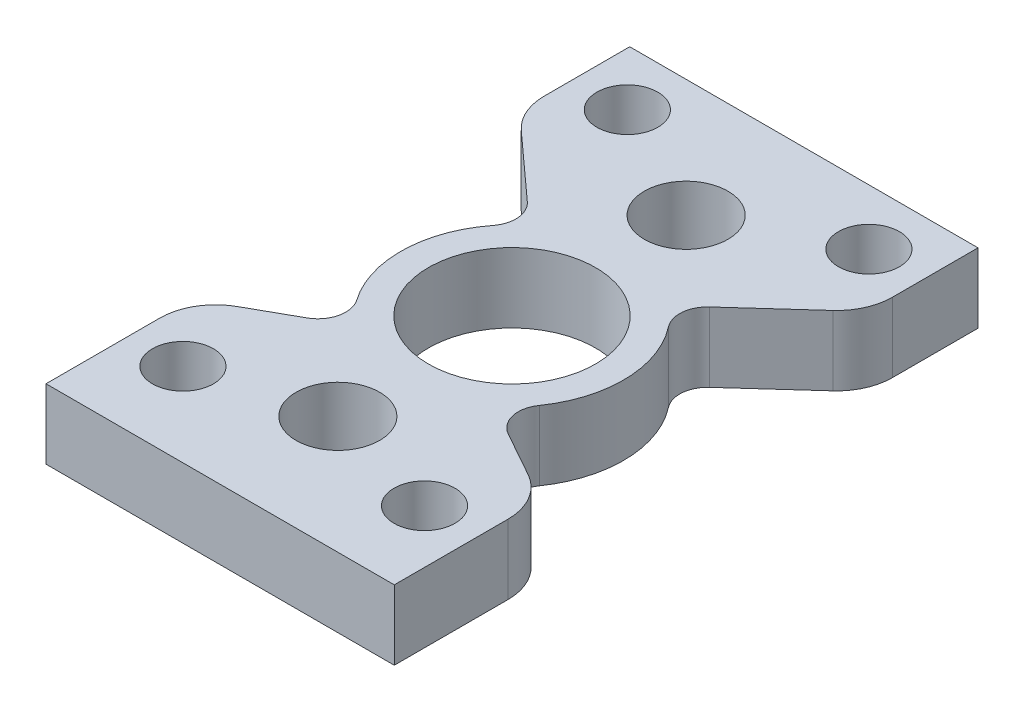
ISO-10303-21;
HEADER;
FILE_DESCRIPTION(('STEP AP214'),'2;1');
FILE_NAME('part.step','',(''),(''),'','','');
FILE_SCHEMA(('AUTOMOTIVE_DESIGN { 1 0 10303 214 1 1 1 1 }'));
ENDSEC;
DATA;
#1=APPLICATION_CONTEXT('core data for automotive mechanical design processes');
#2=APPLICATION_PROTOCOL_DEFINITION('international standard','automotive_design',2000,#1);
#3=PRODUCT_CONTEXT('',#1,'mechanical');
#4=PRODUCT('Part','Part','',(#3));
#5=PRODUCT_RELATED_PRODUCT_CATEGORY('part','',(#4));
#6=PRODUCT_DEFINITION_FORMATION('','',#4);
#7=PRODUCT_DEFINITION_CONTEXT('part definition',#1,'design');
#8=PRODUCT_DEFINITION('design','',#6,#7);
#9=PRODUCT_DEFINITION_SHAPE('','',#8);
#10=(LENGTH_UNIT() NAMED_UNIT(*) SI_UNIT(.MILLI.,.METRE.));
#11=(NAMED_UNIT(*) PLANE_ANGLE_UNIT() SI_UNIT($,.RADIAN.));
#12=(NAMED_UNIT(*) SI_UNIT($,.STERADIAN.) SOLID_ANGLE_UNIT());
#13=UNCERTAINTY_MEASURE_WITH_UNIT(LENGTH_MEASURE(1.E-05),#10,'distance_accuracy_value','');
#14=(GEOMETRIC_REPRESENTATION_CONTEXT(3) GLOBAL_UNCERTAINTY_ASSIGNED_CONTEXT((#13)) GLOBAL_UNIT_ASSIGNED_CONTEXT((#10,
#11,#12)) REPRESENTATION_CONTEXT('',''));
#15=CARTESIAN_POINT('',(0.,0.,0.));
#16=DIRECTION('',(0.,0.,1.));
#17=DIRECTION('',(1.,0.,0.));
#18=AXIS2_PLACEMENT_3D('',#15,#16,#17);
#19=CARTESIAN_POINT('',(-10.795,6.35,-18.8135112898051));
#20=DIRECTION('',(0.,-1.,0.));
#21=DIRECTION('',(0.,0.,-1.));
#22=AXIS2_PLACEMENT_3D('',#19,#20,#21);
#23=PLANE('',#22);
#24=CARTESIAN_POINT('',(3.49148133884313E-12,6.35,-15.8750000000001));
#25=DIRECTION('',(0.,1.,0.));
#26=DIRECTION('',(0.,0.,1.));
#27=AXIS2_PLACEMENT_3D('',#24,#25,#26);
#28=CIRCLE('',#27,3.81);
#29=CARTESIAN_POINT('',(3.49148133884313E-12,6.35,-12.0650000000001));
#30=VERTEX_POINT('',#29);
#31=EDGE_CURVE('E408',#30,#30,#28,.T.);
#32=ORIENTED_EDGE('',*,*,#31,.F.);
#33=EDGE_LOOP('',(#32));
#34=FACE_BOUND('',#33,.T.);
#35=CARTESIAN_POINT('',(-11.0109,6.35,-21.5265));
#36=DIRECTION('',(0.,1.,0.));
#37=DIRECTION('',(0.,0.,-1.));
#38=AXIS2_PLACEMENT_3D('',#35,#36,#37);
#39=CIRCLE('',#38,2.77876000000001);
#40=CARTESIAN_POINT('',(-11.0109,6.35,-24.30526));
#41=VERTEX_POINT('',#40);
#42=EDGE_CURVE('E420',#41,#41,#39,.T.);
#43=ORIENTED_EDGE('',*,*,#42,.F.);
#44=EDGE_LOOP('',(#43));
#45=FACE_BOUND('',#44,.T.);
#46=CARTESIAN_POINT('',(11.0109,6.35,18.9865));
#47=DIRECTION('',(0.,1.,0.));
#48=DIRECTION('',(0.,0.,1.));
#49=AXIS2_PLACEMENT_3D('',#46,#47,#48);
#50=CIRCLE('',#49,2.77876);
#51=CARTESIAN_POINT('',(11.0109,6.35,21.76526));
#52=VERTEX_POINT('',#51);
#53=EDGE_CURVE('E432',#52,#52,#50,.T.);
#54=ORIENTED_EDGE('',*,*,#53,.F.);
#55=EDGE_LOOP('',(#54));
#56=FACE_BOUND('',#55,.T.);
#57=DIRECTION('',(0.,0.,-1.));
#58=VECTOR('',#57,1.);
#59=CARTESIAN_POINT('',(15.875,6.35,-18.8135112898051));
#60=LINE('',#59,#58);
#61=CARTESIAN_POINT('',(15.875,6.35,-18.8135112898051));
#62=VERTEX_POINT('',#61);
#63=CARTESIAN_POINT('',(15.875,6.35,-26.6065));
#64=VERTEX_POINT('',#63);
#65=EDGE_CURVE('E241',#62,#64,#60,.T.);
#66=ORIENTED_EDGE('',*,*,#65,.T.);
#67=DIRECTION('',(-1.,0.,0.));
#68=VECTOR('',#67,1.);
#69=CARTESIAN_POINT('',(-15.875,6.35,-26.6065));
#70=LINE('',#69,#68);
#71=CARTESIAN_POINT('',(-15.875,6.35,-26.6065));
#72=VERTEX_POINT('',#71);
#73=EDGE_CURVE('E129',#64,#72,#70,.T.);
#74=ORIENTED_EDGE('',*,*,#73,.T.);
#75=DIRECTION('',(0.,0.,1.));
#76=VECTOR('',#75,1.);
#77=CARTESIAN_POINT('',(-15.875,6.35,-18.8135112898051));
#78=LINE('',#77,#76);
#79=CARTESIAN_POINT('',(-15.875,6.35,-18.8135112898051));
#80=VERTEX_POINT('',#79);
#81=EDGE_CURVE('E292',#72,#80,#78,.T.);
#82=ORIENTED_EDGE('',*,*,#81,.T.);
#83=CARTESIAN_POINT('',(-10.795,6.35,-18.8135112898051));
#84=DIRECTION('',(0.,1.,0.));
#85=DIRECTION('',(0.,0.,-1.));
#86=AXIS2_PLACEMENT_3D('',#83,#84,#85);
#87=CIRCLE('',#86,5.08);
#88=CARTESIAN_POINT('',(-14.2058875054184,6.35,-15.0489068716251));
#89=VERTEX_POINT('',#88);
#90=EDGE_CURVE('E311',#80,#89,#87,.T.);
#91=ORIENTED_EDGE('',*,*,#90,.T.);
#92=DIRECTION('',(0.741063861846469,0.,0.671434548310702));
#93=VECTOR('',#92,1.);
#94=CARTESIAN_POINT('',(-14.2058875054184,6.35,-15.0489068716251));
#95=LINE('',#94,#93);
#96=CARTESIAN_POINT('',(-8.30284053239606,6.35,-9.70050185277497));
#97=VERTEX_POINT('',#96);
#98=EDGE_CURVE('E308',#89,#97,#95,.T.);
#99=ORIENTED_EDGE('',*,*,#98,.T.);
#100=CARTESIAN_POINT('',(-10.0082842851052,6.35,-7.81819964368494));
#101=DIRECTION('',(0.,-1.,0.));
#102=DIRECTION('',(0.,0.,-1.));
#103=AXIS2_PLACEMENT_3D('',#100,#101,#102);
#104=CIRCLE('',#103,2.54);
#105=CARTESIAN_POINT('',(-8.0066274280842,6.35,-6.25455971494795));
#106=VERTEX_POINT('',#105);
#107=EDGE_CURVE('E310',#97,#106,#104,.T.);
#108=ORIENTED_EDGE('',*,*,#107,.T.);
#109=CARTESIAN_POINT('',(0.,6.35,0.));
#110=DIRECTION('',(0.,1.,0.));
#111=DIRECTION('',(0.,0.,1.));
#112=AXIS2_PLACEMENT_3D('',#109,#110,#111);
#113=CIRCLE('',#112,10.16);
#114=CARTESIAN_POINT('',(-8.32128915849099,6.35,5.8293864806496));
#115=VERTEX_POINT('',#114);
#116=EDGE_CURVE('E313',#106,#115,#113,.T.);
#117=ORIENTED_EDGE('',*,*,#116,.T.);
#118=CARTESIAN_POINT('',(-10.4016114481137,6.35,7.28673310081201));
#119=DIRECTION('',(0.,-1.,0.));
#120=DIRECTION('',(0.,0.,1.));
#121=AXIS2_PLACEMENT_3D('',#118,#119,#120);
#122=CIRCLE('',#121,2.54);
#123=CARTESIAN_POINT('',(-9.1618570457653,6.35,9.50362484870086));
#124=VERTEX_POINT('',#123);
#125=EDGE_CURVE('E319',#115,#124,#122,.T.);
#126=ORIENTED_EDGE('',*,*,#125,.T.);
#127=DIRECTION('',(-0.872792026727894,0.,0.488092284389146));
#128=VECTOR('',#127,1.);
#129=CARTESIAN_POINT('',(-13.2745088046969,6.35,11.8035468581165));
#130=LINE('',#129,#128);
#131=CARTESIAN_POINT('',(-13.2745088046969,6.35,11.8035468581165));
#132=VERTEX_POINT('',#131);
#133=EDGE_CURVE('E321',#124,#132,#130,.T.);
#134=ORIENTED_EDGE('',*,*,#133,.T.);
#135=CARTESIAN_POINT('',(-10.795,6.35,16.2373303538942));
#136=DIRECTION('',(0.,1.,0.));
#137=DIRECTION('',(0.,0.,-1.));
#138=AXIS2_PLACEMENT_3D('',#135,#136,#137);
#139=CIRCLE('',#138,5.08);
#140=CARTESIAN_POINT('',(-15.875,6.35,16.2373303538942));
#141=VERTEX_POINT('',#140);
#142=EDGE_CURVE('E323',#132,#141,#139,.T.);
#143=ORIENTED_EDGE('',*,*,#142,.T.);
#144=DIRECTION('',(0.,0.,1.));
#145=VECTOR('',#144,1.);
#146=CARTESIAN_POINT('',(-15.875,6.35,26.6065));
#147=LINE('',#146,#145);
#148=CARTESIAN_POINT('',(-15.875,6.35,26.6065));
#149=VERTEX_POINT('',#148);
#150=EDGE_CURVE('E325',#141,#149,#147,.T.);
#151=ORIENTED_EDGE('',*,*,#150,.T.);
#152=DIRECTION('',(1.,0.,0.));
#153=VECTOR('',#152,1.);
#154=CARTESIAN_POINT('',(-15.875,6.35,26.6065));
#155=LINE('',#154,#153);
#156=CARTESIAN_POINT('',(15.875,6.35,26.6065));
#157=VERTEX_POINT('',#156);
#158=EDGE_CURVE('E327',#149,#157,#155,.T.);
#159=ORIENTED_EDGE('',*,*,#158,.T.);
#160=DIRECTION('',(0.,0.,-1.));
#161=VECTOR('',#160,1.);
#162=CARTESIAN_POINT('',(15.875,6.35,26.6065));
#163=LINE('',#162,#161);
#164=CARTESIAN_POINT('',(15.875,6.35,16.2373303538942));
#165=VERTEX_POINT('',#164);
#166=EDGE_CURVE('E329',#157,#165,#163,.T.);
#167=ORIENTED_EDGE('',*,*,#166,.T.);
#168=CARTESIAN_POINT('',(10.795,6.35,16.2373303538942));
#169=DIRECTION('',(0.,1.,0.));
#170=DIRECTION('',(0.,0.,1.));
#171=AXIS2_PLACEMENT_3D('',#168,#169,#170);
#172=CIRCLE('',#171,5.08);
#173=CARTESIAN_POINT('',(13.2745088046969,6.35,11.8035468581165));
#174=VERTEX_POINT('',#173);
#175=EDGE_CURVE('E331',#165,#174,#172,.T.);
#176=ORIENTED_EDGE('',*,*,#175,.T.);
#177=DIRECTION('',(-0.872792026727894,0.,-0.488092284389145));
#178=VECTOR('',#177,1.);
#179=CARTESIAN_POINT('',(13.2745088046969,6.35,11.8035468581165));
#180=LINE('',#179,#178);
#181=CARTESIAN_POINT('',(9.1618570457653,6.35,9.50362484870086));
#182=VERTEX_POINT('',#181);
#183=EDGE_CURVE('E333',#174,#182,#180,.T.);
#184=ORIENTED_EDGE('',*,*,#183,.T.);
#185=CARTESIAN_POINT('',(10.4016114481137,6.35,7.28673310081201));
#186=DIRECTION('',(0.,-1.,0.));
#187=DIRECTION('',(0.,0.,-1.));
#188=AXIS2_PLACEMENT_3D('',#185,#186,#187);
#189=CIRCLE('',#188,2.54);
#190=CARTESIAN_POINT('',(8.32128915849099,6.35,5.82938648064961));
#191=VERTEX_POINT('',#190);
#192=EDGE_CURVE('E335',#182,#191,#189,.T.);
#193=ORIENTED_EDGE('',*,*,#192,.T.);
#194=CARTESIAN_POINT('',(0.,6.35,0.));
#195=DIRECTION('',(0.,1.,0.));
#196=DIRECTION('',(0.,0.,1.));
#197=AXIS2_PLACEMENT_3D('',#194,#195,#196);
#198=CIRCLE('',#197,10.16);
#199=CARTESIAN_POINT('',(8.0066274280842,6.35,-6.25455971494795));
#200=VERTEX_POINT('',#199);
#201=EDGE_CURVE('E184',#191,#200,#198,.T.);
#202=ORIENTED_EDGE('',*,*,#201,.T.);
#203=CARTESIAN_POINT('',(10.0082842851052,6.35,-7.81819964368494));
#204=DIRECTION('',(0.,-1.,0.));
#205=DIRECTION('',(0.,0.,1.));
#206=AXIS2_PLACEMENT_3D('',#203,#204,#205);
#207=CIRCLE('',#206,2.54);
#208=CARTESIAN_POINT('',(8.30284053239607,6.35,-9.70050185277497));
#209=VERTEX_POINT('',#208);
#210=EDGE_CURVE('E178',#200,#209,#207,.T.);
#211=ORIENTED_EDGE('',*,*,#210,.T.);
#212=DIRECTION('',(0.741063861846469,0.,-0.671434548310702));
#213=VECTOR('',#212,1.);
#214=CARTESIAN_POINT('',(14.2058875054184,6.35,-15.0489068716251));
#215=LINE('',#214,#213);
#216=CARTESIAN_POINT('',(14.2058875054184,6.35,-15.0489068716251));
#217=VERTEX_POINT('',#216);
#218=EDGE_CURVE('E182',#209,#217,#215,.T.);
#219=ORIENTED_EDGE('',*,*,#218,.T.);
#220=CARTESIAN_POINT('',(10.795,6.35,-18.8135112898051));
#221=DIRECTION('',(0.,1.,0.));
#222=DIRECTION('',(0.,0.,1.));
#223=AXIS2_PLACEMENT_3D('',#220,#221,#222);
#224=CIRCLE('',#223,5.08);
#225=EDGE_CURVE('E50',#217,#62,#224,.T.);
#226=ORIENTED_EDGE('',*,*,#225,.T.);
#227=EDGE_LOOP('',(#66,#74,#82,#91,#99,#108,#117,#126,#134,#143,#151,#159,#167,#176,#184,#193,
#202,#211,#219,#226));
#228=FACE_BOUND('',#227,.T.);
#229=CARTESIAN_POINT('',(11.0109,6.35,-21.5265));
#230=DIRECTION('',(0.,1.,0.));
#231=DIRECTION('',(0.,0.,1.));
#232=AXIS2_PLACEMENT_3D('',#229,#230,#231);
#233=CIRCLE('',#232,2.77876000000001);
#234=CARTESIAN_POINT('',(11.0109,6.35,-18.74774));
#235=VERTEX_POINT('',#234);
#236=EDGE_CURVE('E206',#235,#235,#233,.T.);
#237=ORIENTED_EDGE('',*,*,#236,.F.);
#238=EDGE_LOOP('',(#237));
#239=FACE_BOUND('',#238,.T.);
#240=CARTESIAN_POINT('',(-11.0109,6.35,18.9865));
#241=DIRECTION('',(0.,1.,0.));
#242=DIRECTION('',(0.,0.,-1.));
#243=AXIS2_PLACEMENT_3D('',#240,#241,#242);
#244=CIRCLE('',#243,2.77876);
#245=CARTESIAN_POINT('',(-11.0109,6.35,16.20774));
#246=VERTEX_POINT('',#245);
#247=EDGE_CURVE('E426',#246,#246,#244,.T.);
#248=ORIENTED_EDGE('',*,*,#247,.F.);
#249=EDGE_LOOP('',(#248));
#250=FACE_BOUND('',#249,.T.);
#251=CARTESIAN_POINT('',(0.,6.35,0.));
#252=DIRECTION('',(0.,1.,0.));
#253=DIRECTION('',(0.,0.,1.));
#254=AXIS2_PLACEMENT_3D('',#251,#252,#253);
#255=CIRCLE('',#254,7.62);
#256=CARTESIAN_POINT('',(0.,6.35,7.62));
#257=VERTEX_POINT('',#256);
#258=EDGE_CURVE('E414',#257,#257,#255,.T.);
#259=ORIENTED_EDGE('',*,*,#258,.F.);
#260=EDGE_LOOP('',(#259));
#261=FACE_BOUND('',#260,.T.);
#262=CARTESIAN_POINT('',(3.49148133884313E-12,6.35,15.875));
#263=DIRECTION('',(0.,1.,0.));
#264=DIRECTION('',(0.,0.,1.));
#265=AXIS2_PLACEMENT_3D('',#262,#263,#264);
#266=CIRCLE('',#265,3.81);
#267=CARTESIAN_POINT('',(3.49148133884313E-12,6.35,19.685));
#268=VERTEX_POINT('',#267);
#269=EDGE_CURVE('E399',#268,#268,#266,.T.);
#270=ORIENTED_EDGE('',*,*,#269,.F.);
#271=EDGE_LOOP('',(#270));
#272=FACE_BOUND('',#271,.T.);
#273=ADVANCED_FACE('F33',(#34,#45,#56,#228,#239,#250,#261,#272),#23,.F.);
#274=CARTESIAN_POINT('',(-10.795,0.,-18.8135112898051));
#275=DIRECTION('',(0.,-1.,0.));
#276=DIRECTION('',(0.,0.,-1.));
#277=AXIS2_PLACEMENT_3D('',#274,#275,#276);
#278=PLANE('',#277);
#279=CARTESIAN_POINT('',(3.49148133884313E-12,0.,-15.8750000000001));
#280=DIRECTION('',(0.,1.,0.));
#281=DIRECTION('',(0.,0.,1.));
#282=AXIS2_PLACEMENT_3D('',#279,#280,#281);
#283=CIRCLE('',#282,3.81);
#284=CARTESIAN_POINT('',(3.49148133884313E-12,0.,-12.0650000000001));
#285=VERTEX_POINT('',#284);
#286=EDGE_CURVE('E405',#285,#285,#283,.T.);
#287=ORIENTED_EDGE('',*,*,#286,.T.);
#288=EDGE_LOOP('',(#287));
#289=FACE_BOUND('',#288,.T.);
#290=CARTESIAN_POINT('',(-11.0109,0.,-21.5265));
#291=DIRECTION('',(0.,1.,0.));
#292=DIRECTION('',(0.,0.,-1.));
#293=AXIS2_PLACEMENT_3D('',#290,#291,#292);
#294=CIRCLE('',#293,2.77876000000001);
#295=CARTESIAN_POINT('',(-11.0109,0.,-24.30526));
#296=VERTEX_POINT('',#295);
#297=EDGE_CURVE('E417',#296,#296,#294,.T.);
#298=ORIENTED_EDGE('',*,*,#297,.T.);
#299=EDGE_LOOP('',(#298));
#300=FACE_BOUND('',#299,.T.);
#301=CARTESIAN_POINT('',(11.0109,0.,18.9865));
#302=DIRECTION('',(0.,1.,0.));
#303=DIRECTION('',(0.,0.,1.));
#304=AXIS2_PLACEMENT_3D('',#301,#302,#303);
#305=CIRCLE('',#304,2.77876);
#306=CARTESIAN_POINT('',(11.0109,0.,21.76526));
#307=VERTEX_POINT('',#306);
#308=EDGE_CURVE('E429',#307,#307,#305,.T.);
#309=ORIENTED_EDGE('',*,*,#308,.T.);
#310=EDGE_LOOP('',(#309));
#311=FACE_BOUND('',#310,.T.);
#312=DIRECTION('',(0.,0.,-1.));
#313=VECTOR('',#312,1.);
#314=CARTESIAN_POINT('',(15.875,0.,-18.8135112898051));
#315=LINE('',#314,#313);
#316=CARTESIAN_POINT('',(15.875,0.,-18.8135112898051));
#317=VERTEX_POINT('',#316);
#318=CARTESIAN_POINT('',(15.875,0.,-26.6065));
#319=VERTEX_POINT('',#318);
#320=EDGE_CURVE('E202',#317,#319,#315,.T.);
#321=ORIENTED_EDGE('',*,*,#320,.F.);
#322=CARTESIAN_POINT('',(10.795,0.,-18.8135112898051));
#323=DIRECTION('',(0.,1.,0.));
#324=DIRECTION('',(0.,0.,1.));
#325=AXIS2_PLACEMENT_3D('',#322,#323,#324);
#326=CIRCLE('',#325,5.08);
#327=CARTESIAN_POINT('',(14.2058875054184,0.,-15.0489068716251));
#328=VERTEX_POINT('',#327);
#329=EDGE_CURVE('E121',#328,#317,#326,.T.);
#330=ORIENTED_EDGE('',*,*,#329,.F.);
#331=DIRECTION('',(0.741063861846469,0.,-0.671434548310702));
#332=VECTOR('',#331,1.);
#333=CARTESIAN_POINT('',(14.2058875054184,0.,-15.0489068716251));
#334=LINE('',#333,#332);
#335=CARTESIAN_POINT('',(8.30284053239607,0.,-9.70050185277497));
#336=VERTEX_POINT('',#335);
#337=EDGE_CURVE('E115',#336,#328,#334,.T.);
#338=ORIENTED_EDGE('',*,*,#337,.F.);
#339=CARTESIAN_POINT('',(10.0082842851052,0.,-7.81819964368494));
#340=DIRECTION('',(0.,-1.,0.));
#341=DIRECTION('',(0.,0.,1.));
#342=AXIS2_PLACEMENT_3D('',#339,#340,#341);
#343=CIRCLE('',#342,2.54);
#344=CARTESIAN_POINT('',(8.0066274280842,0.,-6.25455971494795));
#345=VERTEX_POINT('',#344);
#346=EDGE_CURVE('E192',#345,#336,#343,.T.);
#347=ORIENTED_EDGE('',*,*,#346,.F.);
#348=CARTESIAN_POINT('',(0.,0.,0.));
#349=DIRECTION('',(0.,1.,0.));
#350=DIRECTION('',(0.,0.,1.));
#351=AXIS2_PLACEMENT_3D('',#348,#349,#350);
#352=CIRCLE('',#351,10.16);
#353=CARTESIAN_POINT('',(8.32128915849099,0.,5.82938648064961));
#354=VERTEX_POINT('',#353);
#355=EDGE_CURVE('E236',#354,#345,#352,.T.);
#356=ORIENTED_EDGE('',*,*,#355,.F.);
#357=CARTESIAN_POINT('',(10.4016114481137,0.,7.28673310081201));
#358=DIRECTION('',(0.,-1.,0.));
#359=DIRECTION('',(0.,0.,-1.));
#360=AXIS2_PLACEMENT_3D('',#357,#358,#359);
#361=CIRCLE('',#360,2.54);
#362=CARTESIAN_POINT('',(9.1618570457653,0.,9.50362484870086));
#363=VERTEX_POINT('',#362);
#364=EDGE_CURVE('E234',#363,#354,#361,.T.);
#365=ORIENTED_EDGE('',*,*,#364,.F.);
#366=DIRECTION('',(-0.872792026727894,0.,-0.488092284389145));
#367=VECTOR('',#366,1.);
#368=CARTESIAN_POINT('',(13.2745088046969,0.,11.8035468581165));
#369=LINE('',#368,#367);
#370=CARTESIAN_POINT('',(13.2745088046969,0.,11.8035468581165));
#371=VERTEX_POINT('',#370);
#372=EDGE_CURVE('E232',#371,#363,#369,.T.);
#373=ORIENTED_EDGE('',*,*,#372,.F.);
#374=CARTESIAN_POINT('',(10.795,0.,16.2373303538942));
#375=DIRECTION('',(0.,1.,0.));
#376=DIRECTION('',(0.,0.,1.));
#377=AXIS2_PLACEMENT_3D('',#374,#375,#376);
#378=CIRCLE('',#377,5.08);
#379=CARTESIAN_POINT('',(15.875,0.,16.2373303538942));
#380=VERTEX_POINT('',#379);
#381=EDGE_CURVE('E230',#380,#371,#378,.T.);
#382=ORIENTED_EDGE('',*,*,#381,.F.);
#383=DIRECTION('',(0.,0.,-1.));
#384=VECTOR('',#383,1.);
#385=CARTESIAN_POINT('',(15.875,0.,26.6065));
#386=LINE('',#385,#384);
#387=CARTESIAN_POINT('',(15.875,0.,26.6065));
#388=VERTEX_POINT('',#387);
#389=EDGE_CURVE('E228',#388,#380,#386,.T.);
#390=ORIENTED_EDGE('',*,*,#389,.F.);
#391=DIRECTION('',(1.,0.,0.));
#392=VECTOR('',#391,1.);
#393=CARTESIAN_POINT('',(-15.875,0.,26.6065));
#394=LINE('',#393,#392);
#395=CARTESIAN_POINT('',(-15.875,0.,26.6065));
#396=VERTEX_POINT('',#395);
#397=EDGE_CURVE('E226',#396,#388,#394,.T.);
#398=ORIENTED_EDGE('',*,*,#397,.F.);
#399=DIRECTION('',(0.,0.,1.));
#400=VECTOR('',#399,1.);
#401=CARTESIAN_POINT('',(-15.875,0.,26.6065));
#402=LINE('',#401,#400);
#403=CARTESIAN_POINT('',(-15.875,0.,16.2373303538942));
#404=VERTEX_POINT('',#403);
#405=EDGE_CURVE('E224',#404,#396,#402,.T.);
#406=ORIENTED_EDGE('',*,*,#405,.F.);
#407=CARTESIAN_POINT('',(-10.795,0.,16.2373303538942));
#408=DIRECTION('',(0.,1.,0.));
#409=DIRECTION('',(0.,0.,-1.));
#410=AXIS2_PLACEMENT_3D('',#407,#408,#409);
#411=CIRCLE('',#410,5.08);
#412=CARTESIAN_POINT('',(-13.2745088046969,0.,11.8035468581165));
#413=VERTEX_POINT('',#412);
#414=EDGE_CURVE('E222',#413,#404,#411,.T.);
#415=ORIENTED_EDGE('',*,*,#414,.F.);
#416=DIRECTION('',(-0.872792026727894,0.,0.488092284389146));
#417=VECTOR('',#416,1.);
#418=CARTESIAN_POINT('',(-13.2745088046969,0.,11.8035468581165));
#419=LINE('',#418,#417);
#420=CARTESIAN_POINT('',(-9.1618570457653,0.,9.50362484870086));
#421=VERTEX_POINT('',#420);
#422=EDGE_CURVE('E220',#421,#413,#419,.T.);
#423=ORIENTED_EDGE('',*,*,#422,.F.);
#424=CARTESIAN_POINT('',(-10.4016114481137,0.,7.28673310081201));
#425=DIRECTION('',(0.,-1.,0.));
#426=DIRECTION('',(0.,0.,1.));
#427=AXIS2_PLACEMENT_3D('',#424,#425,#426);
#428=CIRCLE('',#427,2.54);
#429=CARTESIAN_POINT('',(-8.32128915849099,0.,5.8293864806496));
#430=VERTEX_POINT('',#429);
#431=EDGE_CURVE('E218',#430,#421,#428,.T.);
#432=ORIENTED_EDGE('',*,*,#431,.F.);
#433=CARTESIAN_POINT('',(0.,0.,0.));
#434=DIRECTION('',(0.,1.,0.));
#435=DIRECTION('',(0.,0.,1.));
#436=AXIS2_PLACEMENT_3D('',#433,#434,#435);
#437=CIRCLE('',#436,10.16);
#438=CARTESIAN_POINT('',(-8.0066274280842,0.,-6.25455971494795));
#439=VERTEX_POINT('',#438);
#440=EDGE_CURVE('E216',#439,#430,#437,.T.);
#441=ORIENTED_EDGE('',*,*,#440,.F.);
#442=CARTESIAN_POINT('',(-10.0082842851052,0.,-7.81819964368494));
#443=DIRECTION('',(0.,-1.,0.));
#444=DIRECTION('',(0.,0.,-1.));
#445=AXIS2_PLACEMENT_3D('',#442,#443,#444);
#446=CIRCLE('',#445,2.54);
#447=CARTESIAN_POINT('',(-8.30284053239606,0.,-9.70050185277497));
#448=VERTEX_POINT('',#447);
#449=EDGE_CURVE('E214',#448,#439,#446,.T.);
#450=ORIENTED_EDGE('',*,*,#449,.F.);
#451=DIRECTION('',(0.741063861846469,0.,0.671434548310702));
#452=VECTOR('',#451,1.);
#453=CARTESIAN_POINT('',(-14.2058875054184,0.,-15.0489068716251));
#454=LINE('',#453,#452);
#455=CARTESIAN_POINT('',(-14.2058875054184,0.,-15.0489068716251));
#456=VERTEX_POINT('',#455);
#457=EDGE_CURVE('E212',#456,#448,#454,.T.);
#458=ORIENTED_EDGE('',*,*,#457,.F.);
#459=CARTESIAN_POINT('',(-10.795,0.,-18.8135112898051));
#460=DIRECTION('',(0.,1.,0.));
#461=DIRECTION('',(0.,0.,-1.));
#462=AXIS2_PLACEMENT_3D('',#459,#460,#461);
#463=CIRCLE('',#462,5.08);
#464=CARTESIAN_POINT('',(-15.875,0.,-18.8135112898051));
#465=VERTEX_POINT('',#464);
#466=EDGE_CURVE('E210',#465,#456,#463,.T.);
#467=ORIENTED_EDGE('',*,*,#466,.F.);
#468=DIRECTION('',(0.,0.,1.));
#469=VECTOR('',#468,1.);
#470=CARTESIAN_POINT('',(-15.875,0.,-18.8135112898051));
#471=LINE('',#470,#469);
#472=CARTESIAN_POINT('',(-15.875,0.,-26.6065));
#473=VERTEX_POINT('',#472);
#474=EDGE_CURVE('E208',#473,#465,#471,.T.);
#475=ORIENTED_EDGE('',*,*,#474,.F.);
#476=DIRECTION('',(-1.,0.,0.));
#477=VECTOR('',#476,1.);
#478=CARTESIAN_POINT('',(-15.875,0.,-26.6065));
#479=LINE('',#478,#477);
#480=EDGE_CURVE('E205',#319,#473,#479,.T.);
#481=ORIENTED_EDGE('',*,*,#480,.F.);
#482=EDGE_LOOP('',(#321,#330,#338,#347,#356,#365,#373,#382,#390,#398,#406,#415,#423,#432,#441,
#450,#458,#467,#475,#481));
#483=FACE_BOUND('',#482,.T.);
#484=CARTESIAN_POINT('',(11.0109,0.,-21.5265));
#485=DIRECTION('',(0.,1.,0.));
#486=DIRECTION('',(0.,0.,1.));
#487=AXIS2_PLACEMENT_3D('',#484,#485,#486);
#488=CIRCLE('',#487,2.77876000000001);
#489=CARTESIAN_POINT('',(11.0109,0.,-18.74774));
#490=VERTEX_POINT('',#489);
#491=EDGE_CURVE('E435',#490,#490,#488,.T.);
#492=ORIENTED_EDGE('',*,*,#491,.T.);
#493=EDGE_LOOP('',(#492));
#494=FACE_BOUND('',#493,.T.);
#495=CARTESIAN_POINT('',(-11.0109,0.,18.9865));
#496=DIRECTION('',(0.,1.,0.));
#497=DIRECTION('',(0.,0.,-1.));
#498=AXIS2_PLACEMENT_3D('',#495,#496,#497);
#499=CIRCLE('',#498,2.77876);
#500=CARTESIAN_POINT('',(-11.0109,0.,16.20774));
#501=VERTEX_POINT('',#500);
#502=EDGE_CURVE('E423',#501,#501,#499,.T.);
#503=ORIENTED_EDGE('',*,*,#502,.T.);
#504=EDGE_LOOP('',(#503));
#505=FACE_BOUND('',#504,.T.);
#506=CARTESIAN_POINT('',(0.,0.,0.));
#507=DIRECTION('',(0.,1.,0.));
#508=DIRECTION('',(0.,0.,1.));
#509=AXIS2_PLACEMENT_3D('',#506,#507,#508);
#510=CIRCLE('',#509,7.62);
#511=CARTESIAN_POINT('',(0.,0.,7.62));
#512=VERTEX_POINT('',#511);
#513=EDGE_CURVE('E411',#512,#512,#510,.T.);
#514=ORIENTED_EDGE('',*,*,#513,.T.);
#515=EDGE_LOOP('',(#514));
#516=FACE_BOUND('',#515,.T.);
#517=CARTESIAN_POINT('',(3.49148133884313E-12,0.,15.875));
#518=DIRECTION('',(0.,1.,0.));
#519=DIRECTION('',(0.,0.,1.));
#520=AXIS2_PLACEMENT_3D('',#517,#518,#519);
#521=CIRCLE('',#520,3.81);
#522=CARTESIAN_POINT('',(3.49148133884313E-12,0.,19.685));
#523=VERTEX_POINT('',#522);
#524=EDGE_CURVE('E402',#523,#523,#521,.T.);
#525=ORIENTED_EDGE('',*,*,#524,.T.);
#526=EDGE_LOOP('',(#525));
#527=FACE_BOUND('',#526,.T.);
#528=ADVANCED_FACE('F296',(#289,#300,#311,#483,#494,#505,#516,#527),#278,.T.);
#529=CARTESIAN_POINT('',(15.875,6.35,-18.8135112898051));
#530=DIRECTION('',(-1.,0.,0.));
#531=DIRECTION('',(0.,0.,1.));
#532=AXIS2_PLACEMENT_3D('',#529,#530,#531);
#533=PLANE('',#532);
#534=ORIENTED_EDGE('',*,*,#320,.T.);
#535=DIRECTION('',(0.,-1.,0.));
#536=VECTOR('',#535,1.);
#537=CARTESIAN_POINT('',(15.875,6.35,-26.6065));
#538=LINE('',#537,#536);
#539=EDGE_CURVE('E11',#64,#319,#538,.T.);
#540=ORIENTED_EDGE('',*,*,#539,.F.);
#541=ORIENTED_EDGE('',*,*,#65,.F.);
#542=DIRECTION('',(0.,-1.,0.));
#543=VECTOR('',#542,1.);
#544=CARTESIAN_POINT('',(15.875,6.35,-18.8135112898051));
#545=LINE('',#544,#543);
#546=EDGE_CURVE('E198',#62,#317,#545,.T.);
#547=ORIENTED_EDGE('',*,*,#546,.T.);
#548=EDGE_LOOP('',(#534,#540,#541,#547));
#549=FACE_BOUND('',#548,.T.);
#550=ADVANCED_FACE('F35',(#549),#533,.F.);
#551=CARTESIAN_POINT('',(-15.875,6.35,-26.6065));
#552=DIRECTION('',(0.,0.,1.));
#553=DIRECTION('',(1.,0.,0.));
#554=AXIS2_PLACEMENT_3D('',#551,#552,#553);
#555=PLANE('',#554);
#556=ORIENTED_EDGE('',*,*,#480,.T.);
#557=DIRECTION('',(0.,-1.,0.));
#558=VECTOR('',#557,1.);
#559=CARTESIAN_POINT('',(-15.875,6.35,-26.6065));
#560=LINE('',#559,#558);
#561=EDGE_CURVE('E42',#72,#473,#560,.T.);
#562=ORIENTED_EDGE('',*,*,#561,.F.);
#563=ORIENTED_EDGE('',*,*,#73,.F.);
#564=ORIENTED_EDGE('',*,*,#539,.T.);
#565=EDGE_LOOP('',(#556,#562,#563,#564));
#566=FACE_BOUND('',#565,.T.);
#567=ADVANCED_FACE('F651',(#566),#555,.F.);
#568=CARTESIAN_POINT('',(-15.875,6.35,-18.8135112898051));
#569=DIRECTION('',(1.,0.,0.));
#570=DIRECTION('',(0.,0.,-1.));
#571=AXIS2_PLACEMENT_3D('',#568,#569,#570);
#572=PLANE('',#571);
#573=ORIENTED_EDGE('',*,*,#474,.T.);
#574=DIRECTION('',(0.,-1.,0.));
#575=VECTOR('',#574,1.);
#576=CARTESIAN_POINT('',(-15.875,6.35,-18.8135112898051));
#577=LINE('',#576,#575);
#578=EDGE_CURVE('E284',#80,#465,#577,.T.);
#579=ORIENTED_EDGE('',*,*,#578,.F.);
#580=ORIENTED_EDGE('',*,*,#81,.F.);
#581=ORIENTED_EDGE('',*,*,#561,.T.);
#582=EDGE_LOOP('',(#573,#579,#580,#581));
#583=FACE_BOUND('',#582,.T.);
#584=ADVANCED_FACE('F290',(#583),#572,.F.);
#585=CARTESIAN_POINT('',(-10.795,6.35,-18.8135112898051));
#586=DIRECTION('',(0.,-1.,0.));
#587=DIRECTION('',(0.,0.,-1.));
#588=AXIS2_PLACEMENT_3D('',#585,#586,#587);
#589=CYLINDRICAL_SURFACE('',#588,5.08);
#590=ORIENTED_EDGE('',*,*,#466,.T.);
#591=DIRECTION('',(0.,-1.,0.));
#592=VECTOR('',#591,1.);
#593=CARTESIAN_POINT('',(-14.2058875054184,6.35,-15.0489068716251));
#594=LINE('',#593,#592);
#595=EDGE_CURVE('E281',#89,#456,#594,.T.);
#596=ORIENTED_EDGE('',*,*,#595,.F.);
#597=ORIENTED_EDGE('',*,*,#90,.F.);
#598=ORIENTED_EDGE('',*,*,#578,.T.);
#599=EDGE_LOOP('',(#590,#596,#597,#598));
#600=FACE_BOUND('',#599,.T.);
#601=ADVANCED_FACE('F302',(#600),#589,.T.);
#602=CARTESIAN_POINT('',(-14.2058875054184,6.35,-15.0489068716251));
#603=DIRECTION('',(0.671434548310702,0.,-0.741063861846469));
#604=DIRECTION('',(-0.741063861846469,0.,-0.671434548310702));
#605=AXIS2_PLACEMENT_3D('',#602,#603,#604);
#606=PLANE('',#605);
#607=ORIENTED_EDGE('',*,*,#457,.T.);
#608=DIRECTION('',(0.,-1.,0.));
#609=VECTOR('',#608,1.);
#610=CARTESIAN_POINT('',(-8.30284053239606,6.35,-9.70050185277497));
#611=LINE('',#610,#609);
#612=EDGE_CURVE('E278',#97,#448,#611,.T.);
#613=ORIENTED_EDGE('',*,*,#612,.F.);
#614=ORIENTED_EDGE('',*,*,#98,.F.);
#615=ORIENTED_EDGE('',*,*,#595,.T.);
#616=EDGE_LOOP('',(#607,#613,#614,#615));
#617=FACE_BOUND('',#616,.T.);
#618=ADVANCED_FACE('F306',(#617),#606,.F.);
#619=CARTESIAN_POINT('',(-10.0082842851052,6.35,-7.81819964368494));
#620=DIRECTION('',(0.,-1.,0.));
#621=DIRECTION('',(0.,0.,-1.));
#622=AXIS2_PLACEMENT_3D('',#619,#620,#621);
#623=CYLINDRICAL_SURFACE('',#622,2.54);
#624=ORIENTED_EDGE('',*,*,#449,.T.);
#625=DIRECTION('',(0.,-1.,0.));
#626=VECTOR('',#625,1.);
#627=CARTESIAN_POINT('',(-8.0066274280842,6.35,-6.25455971494795));
#628=LINE('',#627,#626);
#629=EDGE_CURVE('E275',#106,#439,#628,.T.);
#630=ORIENTED_EDGE('',*,*,#629,.F.);
#631=ORIENTED_EDGE('',*,*,#107,.F.);
#632=ORIENTED_EDGE('',*,*,#612,.T.);
#633=EDGE_LOOP('',(#624,#630,#631,#632));
#634=FACE_BOUND('',#633,.T.);
#635=ADVANCED_FACE('F616',(#634),#623,.F.);
#636=CARTESIAN_POINT('',(0.,6.35,0.));
#637=DIRECTION('',(0.,-1.,0.));
#638=DIRECTION('',(0.,0.,-1.));
#639=AXIS2_PLACEMENT_3D('',#636,#637,#638);
#640=CYLINDRICAL_SURFACE('',#639,10.16);
#641=ORIENTED_EDGE('',*,*,#440,.T.);
#642=DIRECTION('',(0.,-1.,0.));
#643=VECTOR('',#642,1.);
#644=CARTESIAN_POINT('',(-8.32128915849099,6.35,5.8293864806496));
#645=LINE('',#644,#643);
#646=EDGE_CURVE('E272',#115,#430,#645,.T.);
#647=ORIENTED_EDGE('',*,*,#646,.F.);
#648=ORIENTED_EDGE('',*,*,#116,.F.);
#649=ORIENTED_EDGE('',*,*,#629,.T.);
#650=EDGE_LOOP('',(#641,#647,#648,#649));
#651=FACE_BOUND('',#650,.T.);
#652=ADVANCED_FACE('F606',(#651),#640,.T.);
#653=CARTESIAN_POINT('',(-10.4016114481137,6.35,7.28673310081201));
#654=DIRECTION('',(0.,-1.,0.));
#655=DIRECTION('',(0.,0.,-1.));
#656=AXIS2_PLACEMENT_3D('',#653,#654,#655);
#657=CYLINDRICAL_SURFACE('',#656,2.54);
#658=ORIENTED_EDGE('',*,*,#431,.T.);
#659=DIRECTION('',(0.,-1.,0.));
#660=VECTOR('',#659,1.);
#661=CARTESIAN_POINT('',(-9.1618570457653,6.35,9.50362484870086));
#662=LINE('',#661,#660);
#663=EDGE_CURVE('E269',#124,#421,#662,.T.);
#664=ORIENTED_EDGE('',*,*,#663,.F.);
#665=ORIENTED_EDGE('',*,*,#125,.F.);
#666=ORIENTED_EDGE('',*,*,#646,.T.);
#667=EDGE_LOOP('',(#658,#664,#665,#666));
#668=FACE_BOUND('',#667,.T.);
#669=ADVANCED_FACE('F596',(#668),#657,.F.);
#670=CARTESIAN_POINT('',(-13.2745088046969,6.35,11.8035468581165));
#671=DIRECTION('',(0.488092284389145,0.,0.872792026727894));
#672=DIRECTION('',(0.872792026727895,0.,-0.488092284389146));
#673=AXIS2_PLACEMENT_3D('',#670,#671,#672);
#674=PLANE('',#673);
#675=ORIENTED_EDGE('',*,*,#422,.T.);
#676=DIRECTION('',(0.,-1.,0.));
#677=VECTOR('',#676,1.);
#678=CARTESIAN_POINT('',(-13.2745088046969,6.35,11.8035468581165));
#679=LINE('',#678,#677);
#680=EDGE_CURVE('E266',#132,#413,#679,.T.);
#681=ORIENTED_EDGE('',*,*,#680,.F.);
#682=ORIENTED_EDGE('',*,*,#133,.F.);
#683=ORIENTED_EDGE('',*,*,#663,.T.);
#684=EDGE_LOOP('',(#675,#681,#682,#683));
#685=FACE_BOUND('',#684,.T.);
#686=ADVANCED_FACE('F586',(#685),#674,.F.);
#687=CARTESIAN_POINT('',(-10.795,6.35,16.2373303538942));
#688=DIRECTION('',(0.,-1.,0.));
#689=DIRECTION('',(0.,0.,-1.));
#690=AXIS2_PLACEMENT_3D('',#687,#688,#689);
#691=CYLINDRICAL_SURFACE('',#690,5.08);
#692=ORIENTED_EDGE('',*,*,#414,.T.);
#693=DIRECTION('',(0.,-1.,0.));
#694=VECTOR('',#693,1.);
#695=CARTESIAN_POINT('',(-15.875,6.35,16.2373303538942));
#696=LINE('',#695,#694);
#697=EDGE_CURVE('E263',#141,#404,#696,.T.);
#698=ORIENTED_EDGE('',*,*,#697,.F.);
#699=ORIENTED_EDGE('',*,*,#142,.F.);
#700=ORIENTED_EDGE('',*,*,#680,.T.);
#701=EDGE_LOOP('',(#692,#698,#699,#700));
#702=FACE_BOUND('',#701,.T.);
#703=ADVANCED_FACE('F576',(#702),#691,.T.);
#704=CARTESIAN_POINT('',(-15.875,6.35,26.6065));
#705=DIRECTION('',(1.,0.,0.));
#706=DIRECTION('',(0.,0.,-1.));
#707=AXIS2_PLACEMENT_3D('',#704,#705,#706);
#708=PLANE('',#707);
#709=ORIENTED_EDGE('',*,*,#405,.T.);
#710=DIRECTION('',(0.,-1.,0.));
#711=VECTOR('',#710,1.);
#712=CARTESIAN_POINT('',(-15.875,6.35,26.6065));
#713=LINE('',#712,#711);
#714=EDGE_CURVE('E260',#149,#396,#713,.T.);
#715=ORIENTED_EDGE('',*,*,#714,.F.);
#716=ORIENTED_EDGE('',*,*,#150,.F.);
#717=ORIENTED_EDGE('',*,*,#697,.T.);
#718=EDGE_LOOP('',(#709,#715,#716,#717));
#719=FACE_BOUND('',#718,.T.);
#720=ADVANCED_FACE('F566',(#719),#708,.F.);
#721=CARTESIAN_POINT('',(-15.875,6.35,26.6065));
#722=DIRECTION('',(0.,0.,-1.));
#723=DIRECTION('',(-1.,0.,0.));
#724=AXIS2_PLACEMENT_3D('',#721,#722,#723);
#725=PLANE('',#724);
#726=ORIENTED_EDGE('',*,*,#397,.T.);
#727=DIRECTION('',(0.,-1.,0.));
#728=VECTOR('',#727,1.);
#729=CARTESIAN_POINT('',(15.875,6.35,26.6065));
#730=LINE('',#729,#728);
#731=EDGE_CURVE('E257',#157,#388,#730,.T.);
#732=ORIENTED_EDGE('',*,*,#731,.F.);
#733=ORIENTED_EDGE('',*,*,#158,.F.);
#734=ORIENTED_EDGE('',*,*,#714,.T.);
#735=EDGE_LOOP('',(#726,#732,#733,#734));
#736=FACE_BOUND('',#735,.T.);
#737=ADVANCED_FACE('F556',(#736),#725,.F.);
#738=CARTESIAN_POINT('',(15.875,6.35,26.6065));
#739=DIRECTION('',(-1.,0.,0.));
#740=DIRECTION('',(0.,0.,1.));
#741=AXIS2_PLACEMENT_3D('',#738,#739,#740);
#742=PLANE('',#741);
#743=ORIENTED_EDGE('',*,*,#389,.T.);
#744=DIRECTION('',(0.,-1.,0.));
#745=VECTOR('',#744,1.);
#746=CARTESIAN_POINT('',(15.875,6.35,16.2373303538942));
#747=LINE('',#746,#745);
#748=EDGE_CURVE('E254',#165,#380,#747,.T.);
#749=ORIENTED_EDGE('',*,*,#748,.F.);
#750=ORIENTED_EDGE('',*,*,#166,.F.);
#751=ORIENTED_EDGE('',*,*,#731,.T.);
#752=EDGE_LOOP('',(#743,#749,#750,#751));
#753=FACE_BOUND('',#752,.T.);
#754=ADVANCED_FACE('F546',(#753),#742,.F.);
#755=CARTESIAN_POINT('',(10.795,6.35,16.2373303538942));
#756=DIRECTION('',(0.,-1.,0.));
#757=DIRECTION('',(0.,0.,-1.));
#758=AXIS2_PLACEMENT_3D('',#755,#756,#757);
#759=CYLINDRICAL_SURFACE('',#758,5.08);
#760=ORIENTED_EDGE('',*,*,#381,.T.);
#761=DIRECTION('',(0.,-1.,0.));
#762=VECTOR('',#761,1.);
#763=CARTESIAN_POINT('',(13.2745088046969,6.35,11.8035468581165));
#764=LINE('',#763,#762);
#765=EDGE_CURVE('E251',#174,#371,#764,.T.);
#766=ORIENTED_EDGE('',*,*,#765,.F.);
#767=ORIENTED_EDGE('',*,*,#175,.F.);
#768=ORIENTED_EDGE('',*,*,#748,.T.);
#769=EDGE_LOOP('',(#760,#766,#767,#768));
#770=FACE_BOUND('',#769,.T.);
#771=ADVANCED_FACE('F536',(#770),#759,.T.);
#772=CARTESIAN_POINT('',(13.2745088046969,6.35,11.8035468581165));
#773=DIRECTION('',(-0.488092284389145,0.,0.872792026727894));
#774=DIRECTION('',(0.872792026727894,0.,0.488092284389145));
#775=AXIS2_PLACEMENT_3D('',#772,#773,#774);
#776=PLANE('',#775);
#777=ORIENTED_EDGE('',*,*,#372,.T.);
#778=DIRECTION('',(0.,-1.,0.));
#779=VECTOR('',#778,1.);
#780=CARTESIAN_POINT('',(9.1618570457653,6.35,9.50362484870086));
#781=LINE('',#780,#779);
#782=EDGE_CURVE('E248',#182,#363,#781,.T.);
#783=ORIENTED_EDGE('',*,*,#782,.F.);
#784=ORIENTED_EDGE('',*,*,#183,.F.);
#785=ORIENTED_EDGE('',*,*,#765,.T.);
#786=EDGE_LOOP('',(#777,#783,#784,#785));
#787=FACE_BOUND('',#786,.T.);
#788=ADVANCED_FACE('F527',(#787),#776,.F.);
#789=CARTESIAN_POINT('',(10.4016114481137,6.35,7.28673310081201));
#790=DIRECTION('',(0.,-1.,0.));
#791=DIRECTION('',(0.,0.,-1.));
#792=AXIS2_PLACEMENT_3D('',#789,#790,#791);
#793=CYLINDRICAL_SURFACE('',#792,2.54);
#794=ORIENTED_EDGE('',*,*,#364,.T.);
#795=DIRECTION('',(0.,-1.,0.));
#796=VECTOR('',#795,1.);
#797=CARTESIAN_POINT('',(8.32128915849099,6.35,5.82938648064961));
#798=LINE('',#797,#796);
#799=EDGE_CURVE('E245',#191,#354,#798,.T.);
#800=ORIENTED_EDGE('',*,*,#799,.F.);
#801=ORIENTED_EDGE('',*,*,#192,.F.);
#802=ORIENTED_EDGE('',*,*,#782,.T.);
#803=EDGE_LOOP('',(#794,#800,#801,#802));
#804=FACE_BOUND('',#803,.T.);
#805=ADVANCED_FACE('F341',(#804),#793,.F.);
#806=CARTESIAN_POINT('',(0.,6.35,0.));
#807=DIRECTION('',(0.,-1.,0.));
#808=DIRECTION('',(0.,0.,-1.));
#809=AXIS2_PLACEMENT_3D('',#806,#807,#808);
#810=CYLINDRICAL_SURFACE('',#809,10.16);
#811=ORIENTED_EDGE('',*,*,#355,.T.);
#812=DIRECTION('',(0.,-1.,0.));
#813=VECTOR('',#812,1.);
#814=CARTESIAN_POINT('',(8.0066274280842,6.35,-6.25455971494795));
#815=LINE('',#814,#813);
#816=EDGE_CURVE('E193',#200,#345,#815,.T.);
#817=ORIENTED_EDGE('',*,*,#816,.F.);
#818=ORIENTED_EDGE('',*,*,#201,.F.);
#819=ORIENTED_EDGE('',*,*,#799,.T.);
#820=EDGE_LOOP('',(#811,#817,#818,#819));
#821=FACE_BOUND('',#820,.T.);
#822=ADVANCED_FACE('F345',(#821),#810,.T.);
#823=CARTESIAN_POINT('',(10.0082842851052,6.35,-7.81819964368494));
#824=DIRECTION('',(0.,-1.,0.));
#825=DIRECTION('',(0.,0.,-1.));
#826=AXIS2_PLACEMENT_3D('',#823,#824,#825);
#827=CYLINDRICAL_SURFACE('',#826,2.54);
#828=ORIENTED_EDGE('',*,*,#346,.T.);
#829=DIRECTION('',(0.,-1.,0.));
#830=VECTOR('',#829,1.);
#831=CARTESIAN_POINT('',(8.30284053239607,6.35,-9.70050185277497));
#832=LINE('',#831,#830);
#833=EDGE_CURVE('E189',#209,#336,#832,.T.);
#834=ORIENTED_EDGE('',*,*,#833,.F.);
#835=ORIENTED_EDGE('',*,*,#210,.F.);
#836=ORIENTED_EDGE('',*,*,#816,.T.);
#837=EDGE_LOOP('',(#828,#834,#835,#836));
#838=FACE_BOUND('',#837,.T.);
#839=ADVANCED_FACE('F190',(#838),#827,.F.);
#840=CARTESIAN_POINT('',(14.2058875054184,6.35,-15.0489068716251));
#841=DIRECTION('',(-0.671434548310702,0.,-0.741063861846469));
#842=DIRECTION('',(-0.741063861846469,0.,0.671434548310702));
#843=AXIS2_PLACEMENT_3D('',#840,#841,#842);
#844=PLANE('',#843);
#845=ORIENTED_EDGE('',*,*,#337,.T.);
#846=DIRECTION('',(0.,-1.,0.));
#847=VECTOR('',#846,1.);
#848=CARTESIAN_POINT('',(14.2058875054184,6.35,-15.0489068716251));
#849=LINE('',#848,#847);
#850=EDGE_CURVE('E194',#217,#328,#849,.T.);
#851=ORIENTED_EDGE('',*,*,#850,.F.);
#852=ORIENTED_EDGE('',*,*,#218,.F.);
#853=ORIENTED_EDGE('',*,*,#833,.T.);
#854=EDGE_LOOP('',(#845,#851,#852,#853));
#855=FACE_BOUND('',#854,.T.);
#856=ADVANCED_FACE('F196',(#855),#844,.F.);
#857=CARTESIAN_POINT('',(10.795,6.35,-18.8135112898051));
#858=DIRECTION('',(0.,-1.,0.));
#859=DIRECTION('',(0.,0.,-1.));
#860=AXIS2_PLACEMENT_3D('',#857,#858,#859);
#861=CYLINDRICAL_SURFACE('',#860,5.08);
#862=ORIENTED_EDGE('',*,*,#329,.T.);
#863=ORIENTED_EDGE('',*,*,#546,.F.);
#864=ORIENTED_EDGE('',*,*,#225,.F.);
#865=ORIENTED_EDGE('',*,*,#850,.T.);
#866=EDGE_LOOP('',(#862,#863,#864,#865));
#867=FACE_BOUND('',#866,.T.);
#868=ADVANCED_FACE('F349',(#867),#861,.T.);
#869=CARTESIAN_POINT('',(11.0109,6.35,-21.5265));
#870=DIRECTION('',(0.,-1.,0.));
#871=DIRECTION('',(0.,0.,-1.));
#872=AXIS2_PLACEMENT_3D('',#869,#870,#871);
#873=CYLINDRICAL_SURFACE('',#872,2.77876000000001);
#874=ORIENTED_EDGE('',*,*,#236,.T.);
#875=EDGE_LOOP('',(#874));
#876=FACE_BOUND('',#875,.T.);
#877=ORIENTED_EDGE('',*,*,#491,.F.);
#878=EDGE_LOOP('',(#877));
#879=FACE_BOUND('',#878,.T.);
#880=ADVANCED_FACE('F351',(#876,#879),#873,.F.);
#881=CARTESIAN_POINT('',(11.0109,6.35,18.9865));
#882=DIRECTION('',(0.,-1.,0.));
#883=DIRECTION('',(0.,0.,-1.));
#884=AXIS2_PLACEMENT_3D('',#881,#882,#883);
#885=CYLINDRICAL_SURFACE('',#884,2.77876);
#886=ORIENTED_EDGE('',*,*,#53,.T.);
#887=EDGE_LOOP('',(#886));
#888=FACE_BOUND('',#887,.T.);
#889=ORIENTED_EDGE('',*,*,#308,.F.);
#890=EDGE_LOOP('',(#889));
#891=FACE_BOUND('',#890,.T.);
#892=ADVANCED_FACE('F357',(#888,#891),#885,.F.);
#893=CARTESIAN_POINT('',(-11.0109,6.35,18.9865));
#894=DIRECTION('',(0.,-1.,0.));
#895=DIRECTION('',(0.,0.,-1.));
#896=AXIS2_PLACEMENT_3D('',#893,#894,#895);
#897=CYLINDRICAL_SURFACE('',#896,2.77876);
#898=ORIENTED_EDGE('',*,*,#247,.T.);
#899=EDGE_LOOP('',(#898));
#900=FACE_BOUND('',#899,.T.);
#901=ORIENTED_EDGE('',*,*,#502,.F.);
#902=EDGE_LOOP('',(#901));
#903=FACE_BOUND('',#902,.T.);
#904=ADVANCED_FACE('F374',(#900,#903),#897,.F.);
#905=CARTESIAN_POINT('',(-11.0109,6.35,-21.5265));
#906=DIRECTION('',(0.,-1.,0.));
#907=DIRECTION('',(0.,0.,-1.));
#908=AXIS2_PLACEMENT_3D('',#905,#906,#907);
#909=CYLINDRICAL_SURFACE('',#908,2.77876000000001);
#910=ORIENTED_EDGE('',*,*,#42,.T.);
#911=EDGE_LOOP('',(#910));
#912=FACE_BOUND('',#911,.T.);
#913=ORIENTED_EDGE('',*,*,#297,.F.);
#914=EDGE_LOOP('',(#913));
#915=FACE_BOUND('',#914,.T.);
#916=ADVANCED_FACE('F378',(#912,#915),#909,.F.);
#917=CARTESIAN_POINT('',(0.,6.35,0.));
#918=DIRECTION('',(0.,-1.,0.));
#919=DIRECTION('',(0.,0.,-1.));
#920=AXIS2_PLACEMENT_3D('',#917,#918,#919);
#921=CYLINDRICAL_SURFACE('',#920,7.62);
#922=ORIENTED_EDGE('',*,*,#258,.T.);
#923=EDGE_LOOP('',(#922));
#924=FACE_BOUND('',#923,.T.);
#925=ORIENTED_EDGE('',*,*,#513,.F.);
#926=EDGE_LOOP('',(#925));
#927=FACE_BOUND('',#926,.T.);
#928=ADVANCED_FACE('F382',(#924,#927),#921,.F.);
#929=CARTESIAN_POINT('',(3.49148133884313E-12,6.35,-15.8750000000001));
#930=DIRECTION('',(0.,-1.,0.));
#931=DIRECTION('',(0.,0.,-1.));
#932=AXIS2_PLACEMENT_3D('',#929,#930,#931);
#933=CYLINDRICAL_SURFACE('',#932,3.81);
#934=ORIENTED_EDGE('',*,*,#31,.T.);
#935=EDGE_LOOP('',(#934));
#936=FACE_BOUND('',#935,.T.);
#937=ORIENTED_EDGE('',*,*,#286,.F.);
#938=EDGE_LOOP('',(#937));
#939=FACE_BOUND('',#938,.T.);
#940=ADVANCED_FACE('F386',(#936,#939),#933,.F.);
#941=CARTESIAN_POINT('',(3.49148133884313E-12,6.35,15.875));
#942=DIRECTION('',(0.,-1.,0.));
#943=DIRECTION('',(0.,0.,-1.));
#944=AXIS2_PLACEMENT_3D('',#941,#942,#943);
#945=CYLINDRICAL_SURFACE('',#944,3.81);
#946=ORIENTED_EDGE('',*,*,#269,.T.);
#947=EDGE_LOOP('',(#946));
#948=FACE_BOUND('',#947,.T.);
#949=ORIENTED_EDGE('',*,*,#524,.F.);
#950=EDGE_LOOP('',(#949));
#951=FACE_BOUND('',#950,.T.);
#952=ADVANCED_FACE('F390',(#948,#951),#945,.F.);
#953=CLOSED_SHELL('',(#273,#528,#550,#567,#584,#601,#618,#635,#652,#669,#686,#703,#720,#737,
#754,#771,#788,#805,#822,#839,#856,#868,#880,#892,#904,#916,#928,#940,#952));
#954=MANIFOLD_SOLID_BREP('B2',#953);
#955=ADVANCED_BREP_SHAPE_REPRESENTATION('',(#18,#954),#14);
#956=SHAPE_DEFINITION_REPRESENTATION(#9,#955);
ENDSEC;
END-ISO-10303-21;
